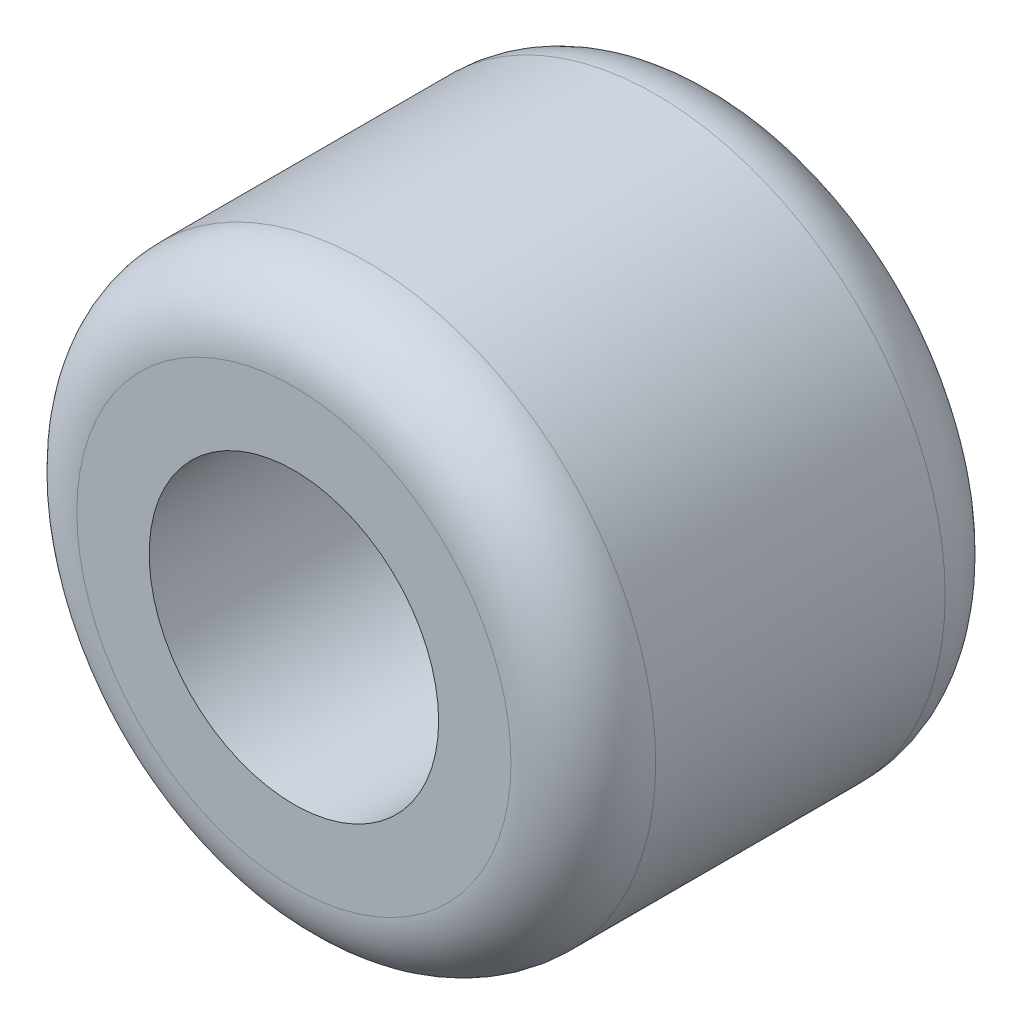
ISO-10303-21;
HEADER;
FILE_DESCRIPTION(('STEP AP214'),'2;1');
FILE_NAME('part.step','',(''),(''),'','','');
FILE_SCHEMA(('AUTOMOTIVE_DESIGN { 1 0 10303 214 1 1 1 1 }'));
ENDSEC;
DATA;
#1=APPLICATION_CONTEXT('core data for automotive mechanical design processes');
#2=APPLICATION_PROTOCOL_DEFINITION('international standard','automotive_design',2000,#1);
#3=PRODUCT_CONTEXT('',#1,'mechanical');
#4=PRODUCT('Part','Part','',(#3));
#5=PRODUCT_RELATED_PRODUCT_CATEGORY('part','',(#4));
#6=PRODUCT_DEFINITION_FORMATION('','',#4);
#7=PRODUCT_DEFINITION_CONTEXT('part definition',#1,'design');
#8=PRODUCT_DEFINITION('design','',#6,#7);
#9=PRODUCT_DEFINITION_SHAPE('','',#8);
#10=(LENGTH_UNIT() NAMED_UNIT(*) SI_UNIT(.MILLI.,.METRE.));
#11=(NAMED_UNIT(*) PLANE_ANGLE_UNIT() SI_UNIT($,.RADIAN.));
#12=(NAMED_UNIT(*) SI_UNIT($,.STERADIAN.) SOLID_ANGLE_UNIT());
#13=UNCERTAINTY_MEASURE_WITH_UNIT(LENGTH_MEASURE(1.E-05),#10,'distance_accuracy_value','');
#14=(GEOMETRIC_REPRESENTATION_CONTEXT(3) GLOBAL_UNCERTAINTY_ASSIGNED_CONTEXT((#13)) GLOBAL_UNIT_ASSIGNED_CONTEXT((#10,
#11,#12)) REPRESENTATION_CONTEXT('',''));
#15=CARTESIAN_POINT('',(0.,0.,0.));
#16=DIRECTION('',(0.,0.,1.));
#17=DIRECTION('',(1.,0.,0.));
#18=AXIS2_PLACEMENT_3D('',#15,#16,#17);
#19=CARTESIAN_POINT('',(0.,0.,6.));
#20=DIRECTION('',(0.,0.,1.));
#21=DIRECTION('',(1.,0.,0.));
#22=AXIS2_PLACEMENT_3D('',#19,#20,#21);
#23=PLANE('',#22);
#24=CARTESIAN_POINT('',(0.,0.,6.));
#25=DIRECTION('',(0.,0.,1.));
#26=DIRECTION('',(1.,0.,0.));
#27=AXIS2_PLACEMENT_3D('',#24,#25,#26);
#28=CIRCLE('',#27,3.);
#29=CARTESIAN_POINT('',(3.,0.,6.));
#30=VERTEX_POINT('',#29);
#31=EDGE_CURVE('E46',#30,#30,#28,.T.);
#32=ORIENTED_EDGE('',*,*,#31,.T.);
#33=EDGE_LOOP('',(#32));
#34=FACE_BOUND('',#33,.T.);
#35=CARTESIAN_POINT('',(0.,0.,6.));
#36=DIRECTION('',(0.,0.,1.));
#37=DIRECTION('',(1.,0.,0.));
#38=AXIS2_PLACEMENT_3D('',#35,#36,#37);
#39=CIRCLE('',#38,2.);
#40=CARTESIAN_POINT('',(2.,0.,6.));
#41=VERTEX_POINT('',#40);
#42=EDGE_CURVE('E51',#41,#41,#39,.T.);
#43=ORIENTED_EDGE('',*,*,#42,.F.);
#44=EDGE_LOOP('',(#43));
#45=FACE_BOUND('',#44,.T.);
#46=ADVANCED_FACE('F31',(#34,#45),#23,.T.);
#47=CARTESIAN_POINT('',(0.,0.,0.));
#48=DIRECTION('',(0.,0.,1.));
#49=DIRECTION('',(1.,0.,0.));
#50=AXIS2_PLACEMENT_3D('',#47,#48,#49);
#51=PLANE('',#50);
#52=CARTESIAN_POINT('',(0.,0.,0.));
#53=DIRECTION('',(0.,0.,1.));
#54=DIRECTION('',(1.,0.,0.));
#55=AXIS2_PLACEMENT_3D('',#52,#53,#54);
#56=CIRCLE('',#55,3.);
#57=CARTESIAN_POINT('',(3.,0.,0.));
#58=VERTEX_POINT('',#57);
#59=EDGE_CURVE('E10',#58,#58,#56,.F.);
#60=ORIENTED_EDGE('',*,*,#59,.T.);
#61=EDGE_LOOP('',(#60));
#62=FACE_BOUND('',#61,.T.);
#63=CARTESIAN_POINT('',(0.,0.,0.));
#64=DIRECTION('',(0.,0.,1.));
#65=DIRECTION('',(1.,0.,0.));
#66=AXIS2_PLACEMENT_3D('',#63,#64,#65);
#67=CIRCLE('',#66,2.);
#68=CARTESIAN_POINT('',(2.,0.,0.));
#69=VERTEX_POINT('',#68);
#70=EDGE_CURVE('E52',#69,#69,#67,.T.);
#71=ORIENTED_EDGE('',*,*,#70,.T.);
#72=EDGE_LOOP('',(#71));
#73=FACE_BOUND('',#72,.T.);
#74=ADVANCED_FACE('F62',(#62,#73),#51,.F.);
#75=CARTESIAN_POINT('',(0.,0.,6.));
#76=DIRECTION('',(0.,0.,-1.));
#77=DIRECTION('',(-1.,0.,0.));
#78=AXIS2_PLACEMENT_3D('',#75,#76,#77);
#79=CYLINDRICAL_SURFACE('',#78,4.);
#80=CARTESIAN_POINT('',(0.,0.,1.));
#81=DIRECTION('',(0.,0.,1.));
#82=DIRECTION('',(1.,0.,0.));
#83=AXIS2_PLACEMENT_3D('',#80,#81,#82);
#84=CIRCLE('',#83,4.);
#85=CARTESIAN_POINT('',(4.,0.,1.));
#86=VERTEX_POINT('',#85);
#87=EDGE_CURVE('E38',#86,#86,#84,.T.);
#88=ORIENTED_EDGE('',*,*,#87,.T.);
#89=EDGE_LOOP('',(#88));
#90=FACE_BOUND('',#89,.T.);
#91=CARTESIAN_POINT('',(0.,0.,5.));
#92=DIRECTION('',(0.,0.,1.));
#93=DIRECTION('',(1.,0.,0.));
#94=AXIS2_PLACEMENT_3D('',#91,#92,#93);
#95=CIRCLE('',#94,4.);
#96=CARTESIAN_POINT('',(4.,0.,5.));
#97=VERTEX_POINT('',#96);
#98=EDGE_CURVE('E42',#97,#97,#95,.F.);
#99=ORIENTED_EDGE('',*,*,#98,.T.);
#100=EDGE_LOOP('',(#99));
#101=FACE_BOUND('',#100,.T.);
#102=ADVANCED_FACE('F68',(#90,#101),#79,.T.);
#103=CARTESIAN_POINT('',(0.,0.,6.));
#104=DIRECTION('',(0.,0.,-1.));
#105=DIRECTION('',(-1.,0.,0.));
#106=AXIS2_PLACEMENT_3D('',#103,#104,#105);
#107=CYLINDRICAL_SURFACE('',#106,2.);
#108=ORIENTED_EDGE('',*,*,#42,.T.);
#109=EDGE_LOOP('',(#108));
#110=FACE_BOUND('',#109,.T.);
#111=ORIENTED_EDGE('',*,*,#70,.F.);
#112=EDGE_LOOP('',(#111));
#113=FACE_BOUND('',#112,.T.);
#114=ADVANCED_FACE('F58',(#110,#113),#107,.F.);
#115=CARTESIAN_POINT('',(0.,0.,5.));
#116=DIRECTION('',(0.,0.,1.));
#117=DIRECTION('',(1.,0.,0.));
#118=AXIS2_PLACEMENT_3D('',#115,#116,#117);
#119=TOROIDAL_SURFACE('',#118,3.,1.);
#120=ORIENTED_EDGE('',*,*,#98,.F.);
#121=EDGE_LOOP('',(#120));
#122=FACE_BOUND('',#121,.T.);
#123=ORIENTED_EDGE('',*,*,#31,.F.);
#124=EDGE_LOOP('',(#123));
#125=FACE_BOUND('',#124,.T.);
#126=ADVANCED_FACE('F73',(#122,#125),#119,.T.);
#127=CARTESIAN_POINT('',(0.,0.,1.));
#128=DIRECTION('',(0.,0.,1.));
#129=DIRECTION('',(1.,0.,0.));
#130=AXIS2_PLACEMENT_3D('',#127,#128,#129);
#131=TOROIDAL_SURFACE('',#130,3.,1.);
#132=ORIENTED_EDGE('',*,*,#59,.F.);
#133=EDGE_LOOP('',(#132));
#134=FACE_BOUND('',#133,.T.);
#135=ORIENTED_EDGE('',*,*,#87,.F.);
#136=EDGE_LOOP('',(#135));
#137=FACE_BOUND('',#136,.T.);
#138=ADVANCED_FACE('F33',(#134,#137),#131,.T.);
#139=CLOSED_SHELL('',(#46,#74,#102,#114,#126,#138));
#140=MANIFOLD_SOLID_BREP('B2',#139);
#141=ADVANCED_BREP_SHAPE_REPRESENTATION('',(#18,#140),#14);
#142=SHAPE_DEFINITION_REPRESENTATION(#9,#141);
ENDSEC;
END-ISO-10303-21;
